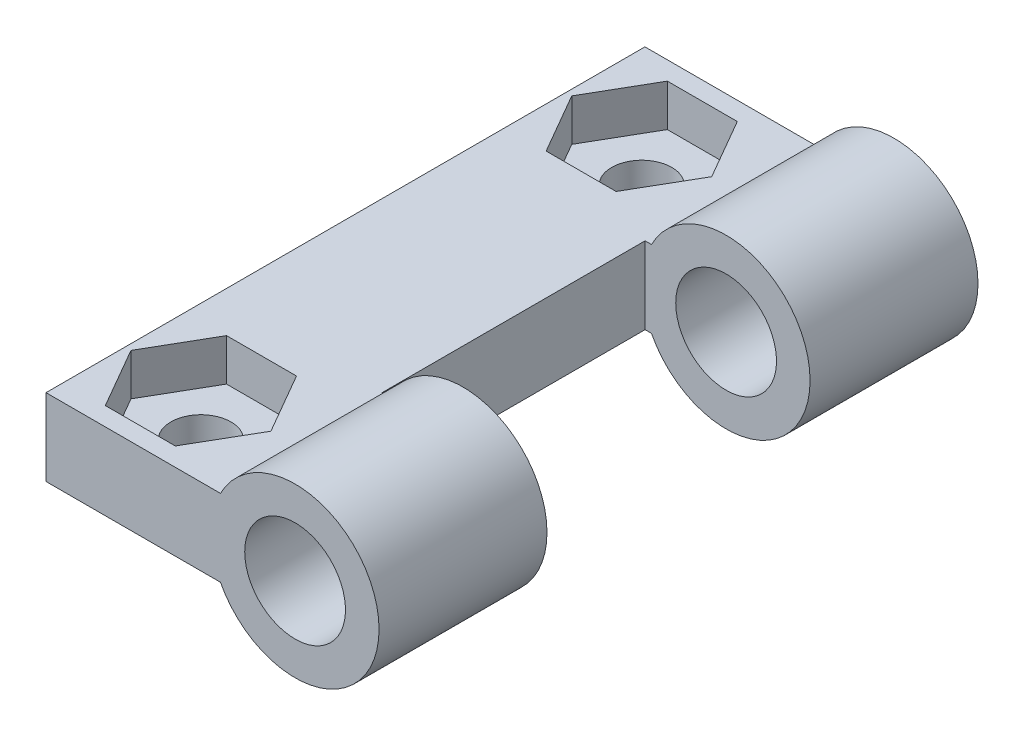
ISO-10303-21;
HEADER;
FILE_DESCRIPTION(('STEP AP214'),'2;1');
FILE_NAME('part.step','',(''),(''),'','','');
FILE_SCHEMA(('AUTOMOTIVE_DESIGN { 1 0 10303 214 1 1 1 1 }'));
ENDSEC;
DATA;
#1=APPLICATION_CONTEXT('core data for automotive mechanical design processes');
#2=APPLICATION_PROTOCOL_DEFINITION('international standard','automotive_design',2000,#1);
#3=PRODUCT_CONTEXT('',#1,'mechanical');
#4=PRODUCT('Part','Part','',(#3));
#5=PRODUCT_RELATED_PRODUCT_CATEGORY('part','',(#4));
#6=PRODUCT_DEFINITION_FORMATION('','',#4);
#7=PRODUCT_DEFINITION_CONTEXT('part definition',#1,'design');
#8=PRODUCT_DEFINITION('design','',#6,#7);
#9=PRODUCT_DEFINITION_SHAPE('','',#8);
#10=(LENGTH_UNIT() NAMED_UNIT(*) SI_UNIT(.MILLI.,.METRE.));
#11=(NAMED_UNIT(*) PLANE_ANGLE_UNIT() SI_UNIT($,.RADIAN.));
#12=(NAMED_UNIT(*) SI_UNIT($,.STERADIAN.) SOLID_ANGLE_UNIT());
#13=UNCERTAINTY_MEASURE_WITH_UNIT(LENGTH_MEASURE(1.E-05),#10,'distance_accuracy_value','');
#14=(GEOMETRIC_REPRESENTATION_CONTEXT(3) GLOBAL_UNCERTAINTY_ASSIGNED_CONTEXT((#13)) GLOBAL_UNIT_ASSIGNED_CONTEXT((#10,
#11,#12)) REPRESENTATION_CONTEXT('',''));
#15=CARTESIAN_POINT('',(0.,0.,0.));
#16=DIRECTION('',(0.,0.,1.));
#17=DIRECTION('',(1.,0.,0.));
#18=AXIS2_PLACEMENT_3D('',#15,#16,#17);
#19=CARTESIAN_POINT('',(17.8,2.75,51.));
#20=DIRECTION('',(0.,0.,-1.));
#21=DIRECTION('',(-1.,0.,0.));
#22=AXIS2_PLACEMENT_3D('',#19,#20,#21);
#23=CYLINDRICAL_SURFACE('',#22,3.60024342983325);
#24=CARTESIAN_POINT('',(17.8,2.75,42.8));
#25=DIRECTION('',(0.,0.,-1.));
#26=DIRECTION('',(-1.,0.,0.));
#27=AXIS2_PLACEMENT_3D('',#24,#25,#26);
#28=CIRCLE('',#27,3.60024342983325);
#29=CARTESIAN_POINT('',(14.1997565701668,2.75,42.8));
#30=VERTEX_POINT('',#29);
#31=EDGE_CURVE('E350',#30,#30,#28,.T.);
#32=ORIENTED_EDGE('',*,*,#31,.F.);
#33=EDGE_LOOP('',(#32));
#34=FACE_BOUND('',#33,.T.);
#35=CARTESIAN_POINT('',(17.8,2.75,30.8));
#36=DIRECTION('',(0.,0.,1.));
#37=DIRECTION('',(1.,0.,0.));
#38=AXIS2_PLACEMENT_3D('',#35,#36,#37);
#39=CIRCLE('',#38,3.60024342983325);
#40=CARTESIAN_POINT('',(21.4002434298332,2.75,30.8));
#41=VERTEX_POINT('',#40);
#42=EDGE_CURVE('E48',#41,#41,#39,.T.);
#43=ORIENTED_EDGE('',*,*,#42,.F.);
#44=EDGE_LOOP('',(#43));
#45=FACE_BOUND('',#44,.T.);
#46=ADVANCED_FACE('F38',(#34,#45),#23,.F.);
#47=CARTESIAN_POINT('',(0.,5.5,0.));
#48=DIRECTION('',(1.,0.,0.));
#49=DIRECTION('',(0.,0.,-1.));
#50=AXIS2_PLACEMENT_3D('',#47,#48,#49);
#51=PLANE('',#50);
#52=DIRECTION('',(0.,0.,1.));
#53=VECTOR('',#52,1.);
#54=CARTESIAN_POINT('',(0.,0.,0.));
#55=LINE('',#54,#53);
#56=CARTESIAN_POINT('',(0.,0.,0.));
#57=VERTEX_POINT('',#56);
#58=CARTESIAN_POINT('',(0.,0.,42.8));
#59=VERTEX_POINT('',#58);
#60=EDGE_CURVE('E374',#57,#59,#55,.T.);
#61=ORIENTED_EDGE('',*,*,#60,.T.);
#62=DIRECTION('',(0.,-1.,0.));
#63=VECTOR('',#62,1.);
#64=CARTESIAN_POINT('',(0.,5.5,42.8));
#65=LINE('',#64,#63);
#66=CARTESIAN_POINT('',(0.,5.5,42.8));
#67=VERTEX_POINT('',#66);
#68=EDGE_CURVE('E400',#67,#59,#65,.T.);
#69=ORIENTED_EDGE('',*,*,#68,.F.);
#70=DIRECTION('',(0.,0.,1.));
#71=VECTOR('',#70,1.);
#72=CARTESIAN_POINT('',(0.,5.5,0.));
#73=LINE('',#72,#71);
#74=CARTESIAN_POINT('',(0.,5.5,0.));
#75=VERTEX_POINT('',#74);
#76=EDGE_CURVE('E375',#75,#67,#73,.T.);
#77=ORIENTED_EDGE('',*,*,#76,.F.);
#78=DIRECTION('',(0.,-1.,0.));
#79=VECTOR('',#78,1.);
#80=CARTESIAN_POINT('',(0.,5.5,0.));
#81=LINE('',#80,#79);
#82=EDGE_CURVE('E387',#75,#57,#81,.T.);
#83=ORIENTED_EDGE('',*,*,#82,.T.);
#84=EDGE_LOOP('',(#61,#69,#77,#83));
#85=FACE_BOUND('',#84,.T.);
#86=ADVANCED_FACE('F40',(#85),#51,.F.);
#87=CARTESIAN_POINT('',(0.,5.5,42.8));
#88=DIRECTION('',(0.,0.,-1.));
#89=DIRECTION('',(-1.,0.,0.));
#90=AXIS2_PLACEMENT_3D('',#87,#88,#89);
#91=PLANE('',#90);
#92=ORIENTED_EDGE('',*,*,#31,.T.);
#93=EDGE_LOOP('',(#92));
#94=FACE_BOUND('',#93,.T.);
#95=DIRECTION('',(1.,0.,0.));
#96=VECTOR('',#95,1.);
#97=CARTESIAN_POINT('',(0.,0.,42.8));
#98=LINE('',#97,#96);
#99=CARTESIAN_POINT('',(12.4673177480746,0.,42.8));
#100=VERTEX_POINT('',#99);
#101=EDGE_CURVE('E391',#59,#100,#98,.T.);
#102=ORIENTED_EDGE('',*,*,#101,.T.);
#103=CARTESIAN_POINT('',(17.8,2.75,42.8));
#104=DIRECTION('',(0.,0.,1.));
#105=DIRECTION('',(1.,0.,0.));
#106=AXIS2_PLACEMENT_3D('',#103,#104,#105);
#107=CIRCLE('',#106,6.);
#108=CARTESIAN_POINT('',(12.4673177480746,5.5,42.8));
#109=VERTEX_POINT('',#108);
#110=EDGE_CURVE('E354',#100,#109,#107,.T.);
#111=ORIENTED_EDGE('',*,*,#110,.T.);
#112=DIRECTION('',(1.,0.,0.));
#113=VECTOR('',#112,1.);
#114=CARTESIAN_POINT('',(0.,5.5,42.8));
#115=LINE('',#114,#113);
#116=EDGE_CURVE('E379',#67,#109,#115,.T.);
#117=ORIENTED_EDGE('',*,*,#116,.F.);
#118=ORIENTED_EDGE('',*,*,#68,.T.);
#119=EDGE_LOOP('',(#102,#111,#117,#118));
#120=FACE_BOUND('',#119,.T.);
#121=ADVANCED_FACE('F454',(#94,#120),#91,.F.);
#122=CARTESIAN_POINT('',(0.,5.5,0.));
#123=DIRECTION('',(0.,0.,1.));
#124=DIRECTION('',(1.,0.,0.));
#125=AXIS2_PLACEMENT_3D('',#122,#123,#124);
#126=PLANE('',#125);
#127=CARTESIAN_POINT('',(17.8,2.75,0.));
#128=DIRECTION('',(0.,0.,-1.));
#129=DIRECTION('',(-1.,0.,0.));
#130=AXIS2_PLACEMENT_3D('',#127,#128,#129);
#131=CIRCLE('',#130,3.60024342983325);
#132=CARTESIAN_POINT('',(14.1997565701668,2.75,0.));
#133=VERTEX_POINT('',#132);
#134=EDGE_CURVE('E342',#133,#133,#131,.T.);
#135=ORIENTED_EDGE('',*,*,#134,.F.);
#136=EDGE_LOOP('',(#135));
#137=FACE_BOUND('',#136,.T.);
#138=DIRECTION('',(-1.,0.,0.));
#139=VECTOR('',#138,1.);
#140=CARTESIAN_POINT('',(0.,5.5,0.));
#141=LINE('',#140,#139);
#142=CARTESIAN_POINT('',(12.4673177480746,5.5,0.));
#143=VERTEX_POINT('',#142);
#144=EDGE_CURVE('E384',#143,#75,#141,.T.);
#145=ORIENTED_EDGE('',*,*,#144,.F.);
#146=CARTESIAN_POINT('',(17.8,2.75,0.));
#147=DIRECTION('',(0.,0.,-1.));
#148=DIRECTION('',(-1.,0.,0.));
#149=AXIS2_PLACEMENT_3D('',#146,#147,#148);
#150=CIRCLE('',#149,6.);
#151=CARTESIAN_POINT('',(12.4673177480746,0.,0.));
#152=VERTEX_POINT('',#151);
#153=EDGE_CURVE('E364',#143,#152,#150,.T.);
#154=ORIENTED_EDGE('',*,*,#153,.T.);
#155=DIRECTION('',(-1.,0.,0.));
#156=VECTOR('',#155,1.);
#157=CARTESIAN_POINT('',(0.,0.,0.));
#158=LINE('',#157,#156);
#159=EDGE_CURVE('E380',#152,#57,#158,.T.);
#160=ORIENTED_EDGE('',*,*,#159,.T.);
#161=ORIENTED_EDGE('',*,*,#82,.F.);
#162=EDGE_LOOP('',(#145,#154,#160,#161));
#163=FACE_BOUND('',#162,.T.);
#164=ADVANCED_FACE('F475',(#137,#163),#126,.F.);
#165=CARTESIAN_POINT('',(0.,5.5,0.));
#166=DIRECTION('',(0.,1.,0.));
#167=DIRECTION('',(0.,0.,1.));
#168=AXIS2_PLACEMENT_3D('',#165,#166,#167);
#169=PLANE('',#168);
#170=DIRECTION('',(-0.5,0.,0.866025403784439));
#171=VECTOR('',#170,1.);
#172=CARTESIAN_POINT('',(0.420411498092338,5.5,5.65));
#173=LINE('',#172,#171);
#174=CARTESIAN_POINT('',(2.92041149809234,5.5,1.31987298107781));
#175=VERTEX_POINT('',#174);
#176=CARTESIAN_POINT('',(0.420411498092339,5.5,5.65));
#177=VERTEX_POINT('',#176);
#178=EDGE_CURVE('E56',#175,#177,#173,.T.);
#179=ORIENTED_EDGE('',*,*,#178,.F.);
#180=DIRECTION('',(-1.,0.,0.));
#181=VECTOR('',#180,1.);
#182=CARTESIAN_POINT('',(2.92041149809234,5.5,1.31987298107781));
#183=LINE('',#182,#181);
#184=CARTESIAN_POINT('',(7.92041149809234,5.5,1.31987298107781));
#185=VERTEX_POINT('',#184);
#186=EDGE_CURVE('E202',#185,#175,#183,.T.);
#187=ORIENTED_EDGE('',*,*,#186,.F.);
#188=DIRECTION('',(-0.5,0.,-0.866025403784439));
#189=VECTOR('',#188,1.);
#190=CARTESIAN_POINT('',(7.92041149809234,5.5,1.31987298107781));
#191=LINE('',#190,#189);
#192=CARTESIAN_POINT('',(10.4204114980923,5.5,5.65));
#193=VERTEX_POINT('',#192);
#194=EDGE_CURVE('E206',#193,#185,#191,.T.);
#195=ORIENTED_EDGE('',*,*,#194,.F.);
#196=DIRECTION('',(0.5,0.,-0.866025403784438));
#197=VECTOR('',#196,1.);
#198=CARTESIAN_POINT('',(10.4204114980923,5.5,5.65));
#199=LINE('',#198,#197);
#200=CARTESIAN_POINT('',(7.92041149809234,5.5,9.98012701892219));
#201=VERTEX_POINT('',#200);
#202=EDGE_CURVE('E230',#201,#193,#199,.T.);
#203=ORIENTED_EDGE('',*,*,#202,.F.);
#204=DIRECTION('',(1.,0.,0.));
#205=VECTOR('',#204,1.);
#206=CARTESIAN_POINT('',(7.92041149809234,5.5,9.98012701892219));
#207=LINE('',#206,#205);
#208=CARTESIAN_POINT('',(2.92041149809234,5.5,9.98012701892219));
#209=VERTEX_POINT('',#208);
#210=EDGE_CURVE('E226',#209,#201,#207,.T.);
#211=ORIENTED_EDGE('',*,*,#210,.F.);
#212=DIRECTION('',(0.5,0.,0.866025403784438));
#213=VECTOR('',#212,1.);
#214=CARTESIAN_POINT('',(2.92041149809234,5.5,9.98012701892219));
#215=LINE('',#214,#213);
#216=EDGE_CURVE('E222',#177,#209,#215,.T.);
#217=ORIENTED_EDGE('',*,*,#216,.F.);
#218=EDGE_LOOP('',(#179,#187,#195,#203,#211,#217));
#219=FACE_BOUND('',#218,.T.);
#220=DIRECTION('',(-1.,0.,0.));
#221=VECTOR('',#220,1.);
#222=CARTESIAN_POINT('',(2.92041149809234,5.5,32.8198729810778));
#223=LINE('',#222,#221);
#224=CARTESIAN_POINT('',(7.92041149809234,5.5,32.8198729810778));
#225=VERTEX_POINT('',#224);
#226=CARTESIAN_POINT('',(2.92041149809234,5.5,32.8198729810778));
#227=VERTEX_POINT('',#226);
#228=EDGE_CURVE('E64',#225,#227,#223,.T.);
#229=ORIENTED_EDGE('',*,*,#228,.F.);
#230=DIRECTION('',(-0.5,0.,-0.866025403784438));
#231=VECTOR('',#230,1.);
#232=CARTESIAN_POINT('',(7.92041149809234,5.5,32.8198729810778));
#233=LINE('',#232,#231);
#234=CARTESIAN_POINT('',(10.4204114980923,5.5,37.15));
#235=VERTEX_POINT('',#234);
#236=EDGE_CURVE('E257',#235,#225,#233,.T.);
#237=ORIENTED_EDGE('',*,*,#236,.F.);
#238=DIRECTION('',(0.5,0.,-0.866025403784439));
#239=VECTOR('',#238,1.);
#240=CARTESIAN_POINT('',(10.4204114980923,5.5,37.15));
#241=LINE('',#240,#239);
#242=CARTESIAN_POINT('',(7.92041149809234,5.5,41.4801270189222));
#243=VERTEX_POINT('',#242);
#244=EDGE_CURVE('E292',#243,#235,#241,.T.);
#245=ORIENTED_EDGE('',*,*,#244,.F.);
#246=DIRECTION('',(1.,0.,0.));
#247=VECTOR('',#246,1.);
#248=CARTESIAN_POINT('',(7.92041149809234,5.5,41.4801270189222));
#249=LINE('',#248,#247);
#250=CARTESIAN_POINT('',(2.92041149809234,5.5,41.4801270189222));
#251=VERTEX_POINT('',#250);
#252=EDGE_CURVE('E288',#251,#243,#249,.T.);
#253=ORIENTED_EDGE('',*,*,#252,.F.);
#254=DIRECTION('',(0.5,0.,0.866025403784439));
#255=VECTOR('',#254,1.);
#256=CARTESIAN_POINT('',(2.92041149809234,5.5,41.4801270189222));
#257=LINE('',#256,#255);
#258=CARTESIAN_POINT('',(0.420411498092338,5.5,37.15));
#259=VERTEX_POINT('',#258);
#260=EDGE_CURVE('E284',#259,#251,#257,.T.);
#261=ORIENTED_EDGE('',*,*,#260,.F.);
#262=DIRECTION('',(-0.500000000000001,0.,0.866025403784438));
#263=VECTOR('',#262,1.);
#264=CARTESIAN_POINT('',(0.420411498092338,5.5,37.15));
#265=LINE('',#264,#263);
#266=EDGE_CURVE('E280',#227,#259,#265,.T.);
#267=ORIENTED_EDGE('',*,*,#266,.F.);
#268=EDGE_LOOP('',(#229,#237,#245,#253,#261,#267));
#269=FACE_BOUND('',#268,.T.);
#270=DIRECTION('',(1.,0.,0.));
#271=VECTOR('',#270,1.);
#272=CARTESIAN_POINT('',(0.,5.5,30.8));
#273=LINE('',#272,#271);
#274=CARTESIAN_POINT('',(12.0086611533924,5.5,30.8));
#275=VERTEX_POINT('',#274);
#276=CARTESIAN_POINT('',(12.4673177480746,5.5,30.8));
#277=VERTEX_POINT('',#276);
#278=EDGE_CURVE('E334',#275,#277,#273,.T.);
#279=ORIENTED_EDGE('',*,*,#278,.F.);
#280=DIRECTION('',(0.,0.,-1.));
#281=VECTOR('',#280,1.);
#282=CARTESIAN_POINT('',(12.0086611533924,5.5,0.));
#283=LINE('',#282,#281);
#284=CARTESIAN_POINT('',(12.0086611533924,5.5,12.));
#285=VERTEX_POINT('',#284);
#286=EDGE_CURVE('E338',#275,#285,#283,.T.);
#287=ORIENTED_EDGE('',*,*,#286,.T.);
#288=DIRECTION('',(-1.,0.,0.));
#289=VECTOR('',#288,1.);
#290=CARTESIAN_POINT('',(0.,5.5,12.));
#291=LINE('',#290,#289);
#292=CARTESIAN_POINT('',(12.4673177480746,5.5,12.));
#293=VERTEX_POINT('',#292);
#294=EDGE_CURVE('E324',#293,#285,#291,.T.);
#295=ORIENTED_EDGE('',*,*,#294,.F.);
#296=DIRECTION('',(0.,0.,-1.));
#297=VECTOR('',#296,1.);
#298=CARTESIAN_POINT('',(12.4673177480746,5.5,12.));
#299=LINE('',#298,#297);
#300=EDGE_CURVE('E368',#143,#293,#299,.F.);
#301=ORIENTED_EDGE('',*,*,#300,.F.);
#302=ORIENTED_EDGE('',*,*,#144,.T.);
#303=ORIENTED_EDGE('',*,*,#76,.T.);
#304=ORIENTED_EDGE('',*,*,#116,.T.);
#305=DIRECTION('',(0.,0.,1.));
#306=VECTOR('',#305,1.);
#307=CARTESIAN_POINT('',(12.4673177480746,5.5,30.8));
#308=LINE('',#307,#306);
#309=EDGE_CURVE('E358',#277,#109,#308,.T.);
#310=ORIENTED_EDGE('',*,*,#309,.F.);
#311=EDGE_LOOP('',(#279,#287,#295,#301,#302,#303,#304,#310));
#312=FACE_BOUND('',#311,.T.);
#313=ADVANCED_FACE('F478',(#219,#269,#312),#169,.T.);
#314=CARTESIAN_POINT('',(0.,0.,0.));
#315=DIRECTION('',(0.,1.,0.));
#316=DIRECTION('',(0.,0.,1.));
#317=AXIS2_PLACEMENT_3D('',#314,#315,#316);
#318=PLANE('',#317);
#319=CARTESIAN_POINT('',(5.42041149809234,0.,5.65));
#320=DIRECTION('',(0.,1.,0.));
#321=DIRECTION('',(0.,0.,1.));
#322=AXIS2_PLACEMENT_3D('',#319,#320,#321);
#323=CIRCLE('',#322,2.15);
#324=CARTESIAN_POINT('',(5.42041149809234,0.,7.8));
#325=VERTEX_POINT('',#324);
#326=EDGE_CURVE('E320',#325,#325,#323,.T.);
#327=ORIENTED_EDGE('',*,*,#326,.T.);
#328=EDGE_LOOP('',(#327));
#329=FACE_BOUND('',#328,.T.);
#330=CARTESIAN_POINT('',(5.42041149809234,0.,37.15));
#331=DIRECTION('',(0.,1.,0.));
#332=DIRECTION('',(0.,0.,1.));
#333=AXIS2_PLACEMENT_3D('',#330,#331,#332);
#334=CIRCLE('',#333,2.15);
#335=CARTESIAN_POINT('',(5.42041149809234,0.,39.3));
#336=VERTEX_POINT('',#335);
#337=EDGE_CURVE('E415',#336,#336,#334,.T.);
#338=ORIENTED_EDGE('',*,*,#337,.T.);
#339=EDGE_LOOP('',(#338));
#340=FACE_BOUND('',#339,.T.);
#341=DIRECTION('',(0.,0.,-1.));
#342=VECTOR('',#341,1.);
#343=CARTESIAN_POINT('',(12.0086611533924,0.,0.));
#344=LINE('',#343,#342);
#345=CARTESIAN_POINT('',(12.0086611533924,0.,30.8));
#346=VERTEX_POINT('',#345);
#347=CARTESIAN_POINT('',(12.0086611533924,0.,12.));
#348=VERTEX_POINT('',#347);
#349=EDGE_CURVE('E11',#346,#348,#344,.T.);
#350=ORIENTED_EDGE('',*,*,#349,.F.);
#351=DIRECTION('',(1.,0.,0.));
#352=VECTOR('',#351,1.);
#353=CARTESIAN_POINT('',(0.,0.,30.8));
#354=LINE('',#353,#352);
#355=CARTESIAN_POINT('',(12.4673177480746,0.,30.8));
#356=VERTEX_POINT('',#355);
#357=EDGE_CURVE('E331',#346,#356,#354,.T.);
#358=ORIENTED_EDGE('',*,*,#357,.T.);
#359=DIRECTION('',(0.,0.,1.));
#360=VECTOR('',#359,1.);
#361=CARTESIAN_POINT('',(12.4673177480746,0.,30.8));
#362=LINE('',#361,#360);
#363=EDGE_CURVE('E408',#356,#100,#362,.T.);
#364=ORIENTED_EDGE('',*,*,#363,.T.);
#365=ORIENTED_EDGE('',*,*,#101,.F.);
#366=ORIENTED_EDGE('',*,*,#60,.F.);
#367=ORIENTED_EDGE('',*,*,#159,.F.);
#368=DIRECTION('',(0.,0.,-1.));
#369=VECTOR('',#368,1.);
#370=CARTESIAN_POINT('',(12.4673177480746,0.,12.));
#371=LINE('',#370,#369);
#372=CARTESIAN_POINT('',(12.4673177480746,0.,12.));
#373=VERTEX_POINT('',#372);
#374=EDGE_CURVE('E404',#152,#373,#371,.F.);
#375=ORIENTED_EDGE('',*,*,#374,.T.);
#376=DIRECTION('',(-1.,0.,0.));
#377=VECTOR('',#376,1.);
#378=CARTESIAN_POINT('',(0.,0.,12.));
#379=LINE('',#378,#377);
#380=EDGE_CURVE('E327',#373,#348,#379,.T.);
#381=ORIENTED_EDGE('',*,*,#380,.T.);
#382=EDGE_LOOP('',(#350,#358,#364,#365,#366,#367,#375,#381));
#383=FACE_BOUND('',#382,.T.);
#384=ADVANCED_FACE('F499',(#329,#340,#383),#318,.F.);
#385=CARTESIAN_POINT('',(17.8,2.75,12.));
#386=DIRECTION('',(0.,0.,-1.));
#387=DIRECTION('',(-1.,0.,0.));
#388=AXIS2_PLACEMENT_3D('',#385,#386,#387);
#389=CYLINDRICAL_SURFACE('',#388,6.);
#390=ORIENTED_EDGE('',*,*,#153,.F.);
#391=ORIENTED_EDGE('',*,*,#300,.T.);
#392=CARTESIAN_POINT('',(17.8,2.75,12.));
#393=DIRECTION('',(0.,0.,-1.));
#394=DIRECTION('',(-1.,0.,0.));
#395=AXIS2_PLACEMENT_3D('',#392,#393,#394);
#396=CIRCLE('',#395,6.);
#397=EDGE_CURVE('E365',#293,#373,#396,.T.);
#398=ORIENTED_EDGE('',*,*,#397,.T.);
#399=ORIENTED_EDGE('',*,*,#374,.F.);
#400=EDGE_LOOP('',(#390,#391,#398,#399));
#401=FACE_BOUND('',#400,.T.);
#402=ADVANCED_FACE('F490',(#401),#389,.T.);
#403=CARTESIAN_POINT('',(17.8,2.75,12.));
#404=DIRECTION('',(0.,0.,-1.));
#405=DIRECTION('',(-1.,0.,0.));
#406=AXIS2_PLACEMENT_3D('',#403,#404,#405);
#407=PLANE('',#406);
#408=ORIENTED_EDGE('',*,*,#397,.F.);
#409=ORIENTED_EDGE('',*,*,#294,.T.);
#410=DIRECTION('',(0.,1.,0.));
#411=VECTOR('',#410,1.);
#412=CARTESIAN_POINT('',(12.0086611533924,8.00413908272315,12.));
#413=LINE('',#412,#411);
#414=EDGE_CURVE('E319',#348,#285,#413,.T.);
#415=ORIENTED_EDGE('',*,*,#414,.F.);
#416=ORIENTED_EDGE('',*,*,#380,.F.);
#417=EDGE_LOOP('',(#408,#409,#415,#416));
#418=FACE_BOUND('',#417,.T.);
#419=CARTESIAN_POINT('',(17.8,2.75,12.));
#420=DIRECTION('',(0.,0.,-1.));
#421=DIRECTION('',(-1.,0.,0.));
#422=AXIS2_PLACEMENT_3D('',#419,#420,#421);
#423=CIRCLE('',#422,3.60024342983325);
#424=CARTESIAN_POINT('',(14.1997565701668,2.75,12.));
#425=VERTEX_POINT('',#424);
#426=EDGE_CURVE('E346',#425,#425,#423,.T.);
#427=ORIENTED_EDGE('',*,*,#426,.T.);
#428=EDGE_LOOP('',(#427));
#429=FACE_BOUND('',#428,.T.);
#430=ADVANCED_FACE('F493',(#418,#429),#407,.F.);
#431=CARTESIAN_POINT('',(17.8,2.75,30.8));
#432=DIRECTION('',(0.,0.,1.));
#433=DIRECTION('',(1.,0.,0.));
#434=AXIS2_PLACEMENT_3D('',#431,#432,#433);
#435=CYLINDRICAL_SURFACE('',#434,6.);
#436=CARTESIAN_POINT('',(17.8,2.75,30.8));
#437=DIRECTION('',(0.,0.,1.));
#438=DIRECTION('',(1.,0.,0.));
#439=AXIS2_PLACEMENT_3D('',#436,#437,#438);
#440=CIRCLE('',#439,6.);
#441=EDGE_CURVE('E355',#356,#277,#440,.T.);
#442=ORIENTED_EDGE('',*,*,#441,.T.);
#443=ORIENTED_EDGE('',*,*,#309,.T.);
#444=ORIENTED_EDGE('',*,*,#110,.F.);
#445=ORIENTED_EDGE('',*,*,#363,.F.);
#446=EDGE_LOOP('',(#442,#443,#444,#445));
#447=FACE_BOUND('',#446,.T.);
#448=ADVANCED_FACE('F469',(#447),#435,.T.);
#449=CARTESIAN_POINT('',(17.8,2.75,30.8));
#450=DIRECTION('',(0.,0.,1.));
#451=DIRECTION('',(1.,0.,0.));
#452=AXIS2_PLACEMENT_3D('',#449,#450,#451);
#453=PLANE('',#452);
#454=ORIENTED_EDGE('',*,*,#42,.T.);
#455=EDGE_LOOP('',(#454));
#456=FACE_BOUND('',#455,.T.);
#457=ORIENTED_EDGE('',*,*,#278,.T.);
#458=ORIENTED_EDGE('',*,*,#441,.F.);
#459=ORIENTED_EDGE('',*,*,#357,.F.);
#460=DIRECTION('',(0.,1.,0.));
#461=VECTOR('',#460,1.);
#462=CARTESIAN_POINT('',(12.0086611533924,8.00413908272315,30.8));
#463=LINE('',#462,#461);
#464=EDGE_CURVE('E315',#346,#275,#463,.T.);
#465=ORIENTED_EDGE('',*,*,#464,.T.);
#466=EDGE_LOOP('',(#457,#458,#459,#465));
#467=FACE_BOUND('',#466,.T.);
#468=ADVANCED_FACE('F462',(#456,#467),#453,.F.);
#469=ORIENTED_EDGE('',*,*,#426,.F.);
#470=EDGE_LOOP('',(#469));
#471=FACE_BOUND('',#470,.T.);
#472=ORIENTED_EDGE('',*,*,#134,.T.);
#473=EDGE_LOOP('',(#472));
#474=FACE_BOUND('',#473,.T.);
#475=ADVANCED_FACE('F450',(#471,#474),#23,.F.);
#476=CARTESIAN_POINT('',(12.0086611533924,8.00413908272315,-0.237108097443355));
#477=DIRECTION('',(1.,0.,0.));
#478=DIRECTION('',(0.,0.,-1.));
#479=AXIS2_PLACEMENT_3D('',#476,#477,#478);
#480=PLANE('',#479);
#481=ORIENTED_EDGE('',*,*,#464,.F.);
#482=ORIENTED_EDGE('',*,*,#349,.T.);
#483=ORIENTED_EDGE('',*,*,#414,.T.);
#484=ORIENTED_EDGE('',*,*,#286,.F.);
#485=EDGE_LOOP('',(#481,#482,#483,#484));
#486=FACE_BOUND('',#485,.T.);
#487=ADVANCED_FACE('F461',(#486),#480,.T.);
#488=CARTESIAN_POINT('',(5.42041149809234,-4.50000000000003,37.15));
#489=DIRECTION('',(0.,1.,0.));
#490=DIRECTION('',(0.,0.,1.));
#491=AXIS2_PLACEMENT_3D('',#488,#489,#490);
#492=CYLINDRICAL_SURFACE('',#491,2.15);
#493=CARTESIAN_POINT('',(5.42041149809234,2.49999999999997,37.15));
#494=DIRECTION('',(0.,-1.,0.));
#495=DIRECTION('',(0.,0.,-1.));
#496=AXIS2_PLACEMENT_3D('',#493,#494,#495);
#497=CIRCLE('',#496,2.15);
#498=CARTESIAN_POINT('',(5.42041149809234,2.49999999999997,35.));
#499=VERTEX_POINT('',#498);
#500=EDGE_CURVE('E42',#499,#499,#497,.F.);
#501=ORIENTED_EDGE('',*,*,#500,.T.);
#502=EDGE_LOOP('',(#501));
#503=FACE_BOUND('',#502,.T.);
#504=ORIENTED_EDGE('',*,*,#337,.F.);
#505=EDGE_LOOP('',(#504));
#506=FACE_BOUND('',#505,.T.);
#507=ADVANCED_FACE('F429',(#503,#506),#492,.F.);
#508=CARTESIAN_POINT('',(5.42041149809234,-4.50000000000003,5.65));
#509=DIRECTION('',(0.,1.,0.));
#510=DIRECTION('',(0.,0.,1.));
#511=AXIS2_PLACEMENT_3D('',#508,#509,#510);
#512=CYLINDRICAL_SURFACE('',#511,2.15);
#513=CARTESIAN_POINT('',(5.42041149809234,2.49999999999997,5.65));
#514=DIRECTION('',(0.,-1.,0.));
#515=DIRECTION('',(0.,0.,-1.));
#516=AXIS2_PLACEMENT_3D('',#513,#514,#515);
#517=CIRCLE('',#516,2.15);
#518=CARTESIAN_POINT('',(5.42041149809234,2.49999999999997,3.5));
#519=VERTEX_POINT('',#518);
#520=EDGE_CURVE('E240',#519,#519,#517,.F.);
#521=ORIENTED_EDGE('',*,*,#520,.T.);
#522=EDGE_LOOP('',(#521));
#523=FACE_BOUND('',#522,.T.);
#524=ORIENTED_EDGE('',*,*,#326,.F.);
#525=EDGE_LOOP('',(#524));
#526=FACE_BOUND('',#525,.T.);
#527=ADVANCED_FACE('F580',(#523,#526),#512,.F.);
#528=CARTESIAN_POINT('',(0.,2.49999999999997,0.));
#529=DIRECTION('',(0.,-1.,0.));
#530=DIRECTION('',(0.,0.,-1.));
#531=AXIS2_PLACEMENT_3D('',#528,#529,#530);
#532=PLANE('',#531);
#533=DIRECTION('',(-0.5,0.,0.866025403784439));
#534=VECTOR('',#533,1.);
#535=CARTESIAN_POINT('',(0.420411498092338,2.49999999999997,5.65));
#536=LINE('',#535,#534);
#537=CARTESIAN_POINT('',(2.92041149809234,2.49999999999997,1.31987298107781));
#538=VERTEX_POINT('',#537);
#539=CARTESIAN_POINT('',(0.420411498092338,2.49999999999997,5.65));
#540=VERTEX_POINT('',#539);
#541=EDGE_CURVE('E179',#538,#540,#536,.T.);
#542=ORIENTED_EDGE('',*,*,#541,.T.);
#543=DIRECTION('',(0.5,0.,0.866025403784438));
#544=VECTOR('',#543,1.);
#545=CARTESIAN_POINT('',(2.92041149809234,2.49999999999997,9.98012701892219));
#546=LINE('',#545,#544);
#547=CARTESIAN_POINT('',(2.92041149809234,2.49999999999997,9.98012701892219));
#548=VERTEX_POINT('',#547);
#549=EDGE_CURVE('E189',#540,#548,#546,.T.);
#550=ORIENTED_EDGE('',*,*,#549,.T.);
#551=DIRECTION('',(1.,0.,0.));
#552=VECTOR('',#551,1.);
#553=CARTESIAN_POINT('',(7.92041149809234,2.49999999999997,9.98012701892219));
#554=LINE('',#553,#552);
#555=CARTESIAN_POINT('',(7.92041149809234,2.49999999999997,9.98012701892219));
#556=VERTEX_POINT('',#555);
#557=EDGE_CURVE('E195',#548,#556,#554,.T.);
#558=ORIENTED_EDGE('',*,*,#557,.T.);
#559=DIRECTION('',(0.5,0.,-0.866025403784438));
#560=VECTOR('',#559,1.);
#561=CARTESIAN_POINT('',(10.4204114980923,2.49999999999997,5.65));
#562=LINE('',#561,#560);
#563=CARTESIAN_POINT('',(10.4204114980923,2.49999999999997,5.65));
#564=VERTEX_POINT('',#563);
#565=EDGE_CURVE('E211',#556,#564,#562,.T.);
#566=ORIENTED_EDGE('',*,*,#565,.T.);
#567=DIRECTION('',(-0.5,0.,-0.866025403784439));
#568=VECTOR('',#567,1.);
#569=CARTESIAN_POINT('',(7.92041149809234,2.49999999999997,1.31987298107781));
#570=LINE('',#569,#568);
#571=CARTESIAN_POINT('',(7.92041149809234,2.49999999999997,1.31987298107781));
#572=VERTEX_POINT('',#571);
#573=EDGE_CURVE('E215',#564,#572,#570,.T.);
#574=ORIENTED_EDGE('',*,*,#573,.T.);
#575=DIRECTION('',(-1.,0.,0.));
#576=VECTOR('',#575,1.);
#577=CARTESIAN_POINT('',(2.92041149809234,2.49999999999997,1.31987298107781));
#578=LINE('',#577,#576);
#579=EDGE_CURVE('E186',#572,#538,#578,.T.);
#580=ORIENTED_EDGE('',*,*,#579,.T.);
#581=EDGE_LOOP('',(#542,#550,#558,#566,#574,#580));
#582=FACE_BOUND('',#581,.T.);
#583=ORIENTED_EDGE('',*,*,#520,.F.);
#584=EDGE_LOOP('',(#583));
#585=FACE_BOUND('',#584,.T.);
#586=ADVANCED_FACE('F197',(#582,#585),#532,.F.);
#587=CARTESIAN_POINT('',(0.420411498092338,2.49999999999997,5.65));
#588=DIRECTION('',(-0.866025403784439,0.,-0.5));
#589=DIRECTION('',(-0.5,0.,0.866025403784439));
#590=AXIS2_PLACEMENT_3D('',#587,#588,#589);
#591=PLANE('',#590);
#592=ORIENTED_EDGE('',*,*,#178,.T.);
#593=DIRECTION('',(0.,1.,0.));
#594=VECTOR('',#593,1.);
#595=CARTESIAN_POINT('',(0.420411498092338,2.49999999999997,5.65));
#596=LINE('',#595,#594);
#597=EDGE_CURVE('E175',#540,#177,#596,.T.);
#598=ORIENTED_EDGE('',*,*,#597,.F.);
#599=ORIENTED_EDGE('',*,*,#541,.F.);
#600=DIRECTION('',(0.,1.,0.));
#601=VECTOR('',#600,1.);
#602=CARTESIAN_POINT('',(2.92041149809234,2.49999999999997,1.31987298107781));
#603=LINE('',#602,#601);
#604=EDGE_CURVE('E237',#538,#175,#603,.T.);
#605=ORIENTED_EDGE('',*,*,#604,.T.);
#606=EDGE_LOOP('',(#592,#598,#599,#605));
#607=FACE_BOUND('',#606,.T.);
#608=ADVANCED_FACE('F177',(#607),#591,.F.);
#609=CARTESIAN_POINT('',(2.92041149809234,2.49999999999997,1.31987298107781));
#610=DIRECTION('',(0.,0.,-1.));
#611=DIRECTION('',(-1.,0.,0.));
#612=AXIS2_PLACEMENT_3D('',#609,#610,#611);
#613=PLANE('',#612);
#614=ORIENTED_EDGE('',*,*,#186,.T.);
#615=ORIENTED_EDGE('',*,*,#604,.F.);
#616=ORIENTED_EDGE('',*,*,#579,.F.);
#617=DIRECTION('',(0.,1.,0.));
#618=VECTOR('',#617,1.);
#619=CARTESIAN_POINT('',(7.92041149809234,2.49999999999997,1.31987298107781));
#620=LINE('',#619,#618);
#621=EDGE_CURVE('E241',#572,#185,#620,.T.);
#622=ORIENTED_EDGE('',*,*,#621,.T.);
#623=EDGE_LOOP('',(#614,#615,#616,#622));
#624=FACE_BOUND('',#623,.T.);
#625=ADVANCED_FACE('F598',(#624),#613,.F.);
#626=CARTESIAN_POINT('',(7.92041149809234,2.49999999999997,1.31987298107781));
#627=DIRECTION('',(0.866025403784439,0.,-0.5));
#628=DIRECTION('',(-0.5,0.,-0.866025403784439));
#629=AXIS2_PLACEMENT_3D('',#626,#627,#628);
#630=PLANE('',#629);
#631=ORIENTED_EDGE('',*,*,#194,.T.);
#632=ORIENTED_EDGE('',*,*,#621,.F.);
#633=ORIENTED_EDGE('',*,*,#573,.F.);
#634=DIRECTION('',(0.,1.,0.));
#635=VECTOR('',#634,1.);
#636=CARTESIAN_POINT('',(10.4204114980923,2.49999999999997,5.65));
#637=LINE('',#636,#635);
#638=EDGE_CURVE('E244',#564,#193,#637,.T.);
#639=ORIENTED_EDGE('',*,*,#638,.T.);
#640=EDGE_LOOP('',(#631,#632,#633,#639));
#641=FACE_BOUND('',#640,.T.);
#642=ADVANCED_FACE('F604',(#641),#630,.F.);
#643=CARTESIAN_POINT('',(10.4204114980923,2.49999999999997,5.65));
#644=DIRECTION('',(0.866025403784439,0.,0.5));
#645=DIRECTION('',(0.5,0.,-0.866025403784439));
#646=AXIS2_PLACEMENT_3D('',#643,#644,#645);
#647=PLANE('',#646);
#648=ORIENTED_EDGE('',*,*,#202,.T.);
#649=ORIENTED_EDGE('',*,*,#638,.F.);
#650=ORIENTED_EDGE('',*,*,#565,.F.);
#651=DIRECTION('',(0.,1.,0.));
#652=VECTOR('',#651,1.);
#653=CARTESIAN_POINT('',(7.92041149809234,2.49999999999997,9.98012701892219));
#654=LINE('',#653,#652);
#655=EDGE_CURVE('E247',#556,#201,#654,.T.);
#656=ORIENTED_EDGE('',*,*,#655,.T.);
#657=EDGE_LOOP('',(#648,#649,#650,#656));
#658=FACE_BOUND('',#657,.T.);
#659=ADVANCED_FACE('F612',(#658),#647,.F.);
#660=CARTESIAN_POINT('',(7.92041149809234,2.49999999999997,9.98012701892219));
#661=DIRECTION('',(0.,0.,1.));
#662=DIRECTION('',(1.,0.,0.));
#663=AXIS2_PLACEMENT_3D('',#660,#661,#662);
#664=PLANE('',#663);
#665=ORIENTED_EDGE('',*,*,#210,.T.);
#666=ORIENTED_EDGE('',*,*,#655,.F.);
#667=ORIENTED_EDGE('',*,*,#557,.F.);
#668=DIRECTION('',(0.,1.,0.));
#669=VECTOR('',#668,1.);
#670=CARTESIAN_POINT('',(2.92041149809234,2.49999999999997,9.98012701892219));
#671=LINE('',#670,#669);
#672=EDGE_CURVE('E185',#548,#209,#671,.T.);
#673=ORIENTED_EDGE('',*,*,#672,.T.);
#674=EDGE_LOOP('',(#665,#666,#667,#673));
#675=FACE_BOUND('',#674,.T.);
#676=ADVANCED_FACE('F443',(#675),#664,.F.);
#677=CARTESIAN_POINT('',(2.92041149809234,2.49999999999997,9.98012701892219));
#678=DIRECTION('',(-0.866025403784438,0.,0.5));
#679=DIRECTION('',(0.5,0.,0.866025403784438));
#680=AXIS2_PLACEMENT_3D('',#677,#678,#679);
#681=PLANE('',#680);
#682=ORIENTED_EDGE('',*,*,#216,.T.);
#683=ORIENTED_EDGE('',*,*,#672,.F.);
#684=ORIENTED_EDGE('',*,*,#549,.F.);
#685=ORIENTED_EDGE('',*,*,#597,.T.);
#686=EDGE_LOOP('',(#682,#683,#684,#685));
#687=FACE_BOUND('',#686,.T.);
#688=ADVANCED_FACE('F190',(#687),#681,.F.);
#689=CARTESIAN_POINT('',(0.,2.49999999999997,0.));
#690=DIRECTION('',(0.,-1.,0.));
#691=DIRECTION('',(0.,0.,-1.));
#692=AXIS2_PLACEMENT_3D('',#689,#690,#691);
#693=PLANE('',#692);
#694=DIRECTION('',(-1.,0.,0.));
#695=VECTOR('',#694,1.);
#696=CARTESIAN_POINT('',(2.92041149809234,2.49999999999997,32.8198729810778));
#697=LINE('',#696,#695);
#698=CARTESIAN_POINT('',(7.92041149809234,2.49999999999997,32.8198729810778));
#699=VERTEX_POINT('',#698);
#700=CARTESIAN_POINT('',(2.92041149809234,2.49999999999997,32.8198729810778));
#701=VERTEX_POINT('',#700);
#702=EDGE_CURVE('E252',#699,#701,#697,.T.);
#703=ORIENTED_EDGE('',*,*,#702,.T.);
#704=DIRECTION('',(-0.500000000000001,0.,0.866025403784438));
#705=VECTOR('',#704,1.);
#706=CARTESIAN_POINT('',(0.420411498092338,2.49999999999997,37.15));
#707=LINE('',#706,#705);
#708=CARTESIAN_POINT('',(0.420411498092338,2.49999999999997,37.15));
#709=VERTEX_POINT('',#708);
#710=EDGE_CURVE('E256',#701,#709,#707,.T.);
#711=ORIENTED_EDGE('',*,*,#710,.T.);
#712=DIRECTION('',(0.5,0.,0.866025403784439));
#713=VECTOR('',#712,1.);
#714=CARTESIAN_POINT('',(2.92041149809234,2.49999999999997,41.4801270189222));
#715=LINE('',#714,#713);
#716=CARTESIAN_POINT('',(2.92041149809234,2.49999999999997,41.4801270189222));
#717=VERTEX_POINT('',#716);
#718=EDGE_CURVE('E261',#709,#717,#715,.T.);
#719=ORIENTED_EDGE('',*,*,#718,.T.);
#720=DIRECTION('',(1.,0.,0.));
#721=VECTOR('',#720,1.);
#722=CARTESIAN_POINT('',(7.92041149809234,2.49999999999997,41.4801270189222));
#723=LINE('',#722,#721);
#724=CARTESIAN_POINT('',(7.92041149809234,2.49999999999997,41.4801270189222));
#725=VERTEX_POINT('',#724);
#726=EDGE_CURVE('E265',#717,#725,#723,.T.);
#727=ORIENTED_EDGE('',*,*,#726,.T.);
#728=DIRECTION('',(0.5,0.,-0.866025403784439));
#729=VECTOR('',#728,1.);
#730=CARTESIAN_POINT('',(10.4204114980923,2.49999999999997,37.15));
#731=LINE('',#730,#729);
#732=CARTESIAN_POINT('',(10.4204114980923,2.49999999999997,37.15));
#733=VERTEX_POINT('',#732);
#734=EDGE_CURVE('E269',#725,#733,#731,.T.);
#735=ORIENTED_EDGE('',*,*,#734,.T.);
#736=DIRECTION('',(-0.5,0.,-0.866025403784438));
#737=VECTOR('',#736,1.);
#738=CARTESIAN_POINT('',(7.92041149809234,2.49999999999997,32.8198729810778));
#739=LINE('',#738,#737);
#740=EDGE_CURVE('E273',#733,#699,#739,.T.);
#741=ORIENTED_EDGE('',*,*,#740,.T.);
#742=EDGE_LOOP('',(#703,#711,#719,#727,#735,#741));
#743=FACE_BOUND('',#742,.T.);
#744=ORIENTED_EDGE('',*,*,#500,.F.);
#745=EDGE_LOOP('',(#744));
#746=FACE_BOUND('',#745,.T.);
#747=ADVANCED_FACE('F432',(#743,#746),#693,.F.);
#748=CARTESIAN_POINT('',(2.92041149809234,2.49999999999997,32.8198729810778));
#749=DIRECTION('',(0.,0.,-1.));
#750=DIRECTION('',(-1.,0.,0.));
#751=AXIS2_PLACEMENT_3D('',#748,#749,#750);
#752=PLANE('',#751);
#753=ORIENTED_EDGE('',*,*,#228,.T.);
#754=DIRECTION('',(0.,1.,0.));
#755=VECTOR('',#754,1.);
#756=CARTESIAN_POINT('',(2.92041149809234,2.49999999999997,32.8198729810778));
#757=LINE('',#756,#755);
#758=EDGE_CURVE('E277',#701,#227,#757,.T.);
#759=ORIENTED_EDGE('',*,*,#758,.F.);
#760=ORIENTED_EDGE('',*,*,#702,.F.);
#761=DIRECTION('',(0.,1.,0.));
#762=VECTOR('',#761,1.);
#763=CARTESIAN_POINT('',(7.92041149809234,2.49999999999997,32.8198729810778));
#764=LINE('',#763,#762);
#765=EDGE_CURVE('E223',#699,#225,#764,.T.);
#766=ORIENTED_EDGE('',*,*,#765,.T.);
#767=EDGE_LOOP('',(#753,#759,#760,#766));
#768=FACE_BOUND('',#767,.T.);
#769=ADVANCED_FACE('F434',(#768),#752,.F.);
#770=CARTESIAN_POINT('',(7.92041149809234,2.49999999999997,32.8198729810778));
#771=DIRECTION('',(0.866025403784438,0.,-0.5));
#772=DIRECTION('',(-0.5,0.,-0.866025403784439));
#773=AXIS2_PLACEMENT_3D('',#770,#771,#772);
#774=PLANE('',#773);
#775=ORIENTED_EDGE('',*,*,#236,.T.);
#776=ORIENTED_EDGE('',*,*,#765,.F.);
#777=ORIENTED_EDGE('',*,*,#740,.F.);
#778=DIRECTION('',(0.,1.,0.));
#779=VECTOR('',#778,1.);
#780=CARTESIAN_POINT('',(10.4204114980923,2.49999999999997,37.15));
#781=LINE('',#780,#779);
#782=EDGE_CURVE('E301',#733,#235,#781,.T.);
#783=ORIENTED_EDGE('',*,*,#782,.T.);
#784=EDGE_LOOP('',(#775,#776,#777,#783));
#785=FACE_BOUND('',#784,.T.);
#786=ADVANCED_FACE('F441',(#785),#774,.F.);
#787=CARTESIAN_POINT('',(10.4204114980923,2.49999999999997,37.15));
#788=DIRECTION('',(0.866025403784439,0.,0.5));
#789=DIRECTION('',(0.5,0.,-0.866025403784439));
#790=AXIS2_PLACEMENT_3D('',#787,#788,#789);
#791=PLANE('',#790);
#792=ORIENTED_EDGE('',*,*,#244,.T.);
#793=ORIENTED_EDGE('',*,*,#782,.F.);
#794=ORIENTED_EDGE('',*,*,#734,.F.);
#795=DIRECTION('',(0.,1.,0.));
#796=VECTOR('',#795,1.);
#797=CARTESIAN_POINT('',(7.92041149809234,2.49999999999997,41.4801270189222));
#798=LINE('',#797,#796);
#799=EDGE_CURVE('E304',#725,#243,#798,.T.);
#800=ORIENTED_EDGE('',*,*,#799,.T.);
#801=EDGE_LOOP('',(#792,#793,#794,#800));
#802=FACE_BOUND('',#801,.T.);
#803=ADVANCED_FACE('F651',(#802),#791,.F.);
#804=CARTESIAN_POINT('',(7.92041149809234,2.49999999999997,41.4801270189222));
#805=DIRECTION('',(0.,0.,1.));
#806=DIRECTION('',(1.,0.,0.));
#807=AXIS2_PLACEMENT_3D('',#804,#805,#806);
#808=PLANE('',#807);
#809=ORIENTED_EDGE('',*,*,#252,.T.);
#810=ORIENTED_EDGE('',*,*,#799,.F.);
#811=ORIENTED_EDGE('',*,*,#726,.F.);
#812=DIRECTION('',(0.,1.,0.));
#813=VECTOR('',#812,1.);
#814=CARTESIAN_POINT('',(2.92041149809234,2.49999999999997,41.4801270189222));
#815=LINE('',#814,#813);
#816=EDGE_CURVE('E307',#717,#251,#815,.T.);
#817=ORIENTED_EDGE('',*,*,#816,.T.);
#818=EDGE_LOOP('',(#809,#810,#811,#817));
#819=FACE_BOUND('',#818,.T.);
#820=ADVANCED_FACE('F660',(#819),#808,.F.);
#821=CARTESIAN_POINT('',(2.92041149809234,2.49999999999997,41.4801270189222));
#822=DIRECTION('',(-0.866025403784439,0.,0.5));
#823=DIRECTION('',(0.5,0.,0.866025403784439));
#824=AXIS2_PLACEMENT_3D('',#821,#822,#823);
#825=PLANE('',#824);
#826=ORIENTED_EDGE('',*,*,#260,.T.);
#827=ORIENTED_EDGE('',*,*,#816,.F.);
#828=ORIENTED_EDGE('',*,*,#718,.F.);
#829=DIRECTION('',(0.,1.,0.));
#830=VECTOR('',#829,1.);
#831=CARTESIAN_POINT('',(0.420411498092338,2.49999999999997,37.15));
#832=LINE('',#831,#830);
#833=EDGE_CURVE('E310',#709,#259,#832,.T.);
#834=ORIENTED_EDGE('',*,*,#833,.T.);
#835=EDGE_LOOP('',(#826,#827,#828,#834));
#836=FACE_BOUND('',#835,.T.);
#837=ADVANCED_FACE('F670',(#836),#825,.F.);
#838=CARTESIAN_POINT('',(0.420411498092338,2.49999999999997,37.15));
#839=DIRECTION('',(-0.866025403784438,0.,-0.500000000000001));
#840=DIRECTION('',(-0.500000000000001,0.,0.866025403784438));
#841=AXIS2_PLACEMENT_3D('',#838,#839,#840);
#842=PLANE('',#841);
#843=ORIENTED_EDGE('',*,*,#266,.T.);
#844=ORIENTED_EDGE('',*,*,#833,.F.);
#845=ORIENTED_EDGE('',*,*,#710,.F.);
#846=ORIENTED_EDGE('',*,*,#758,.T.);
#847=EDGE_LOOP('',(#843,#844,#845,#846));
#848=FACE_BOUND('',#847,.T.);
#849=ADVANCED_FACE('F680',(#848),#842,.F.);
#850=CLOSED_SHELL('',(#46,#86,#121,#164,#313,#384,#402,#430,#448,#468,#475,#487,#507,#527,#586,
#608,#625,#642,#659,#676,#688,#747,#769,#786,#803,#820,#837,#849));
#851=MANIFOLD_SOLID_BREP('B2',#850);
#852=ADVANCED_BREP_SHAPE_REPRESENTATION('',(#18,#851),#14);
#853=SHAPE_DEFINITION_REPRESENTATION(#9,#852);
ENDSEC;
END-ISO-10303-21;
